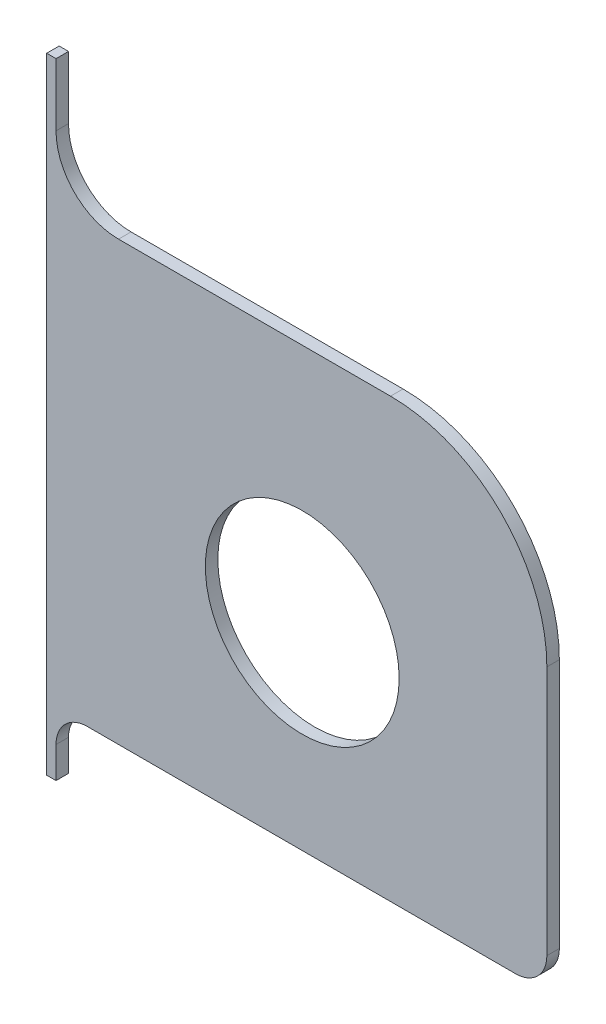
ISO-10303-21;
HEADER;
FILE_DESCRIPTION(('STEP AP214'),'2;1');
FILE_NAME('part.step','',(''),(''),'','','');
FILE_SCHEMA(('AUTOMOTIVE_DESIGN { 1 0 10303 214 1 1 1 1 }'));
ENDSEC;
DATA;
#1=APPLICATION_CONTEXT('core data for automotive mechanical design processes');
#2=APPLICATION_PROTOCOL_DEFINITION('international standard','automotive_design',2000,#1);
#3=PRODUCT_CONTEXT('',#1,'mechanical');
#4=PRODUCT('Part','Part','',(#3));
#5=PRODUCT_RELATED_PRODUCT_CATEGORY('part','',(#4));
#6=PRODUCT_DEFINITION_FORMATION('','',#4);
#7=PRODUCT_DEFINITION_CONTEXT('part definition',#1,'design');
#8=PRODUCT_DEFINITION('design','',#6,#7);
#9=PRODUCT_DEFINITION_SHAPE('','',#8);
#10=(LENGTH_UNIT() NAMED_UNIT(*) SI_UNIT(.MILLI.,.METRE.));
#11=(NAMED_UNIT(*) PLANE_ANGLE_UNIT() SI_UNIT($,.RADIAN.));
#12=(NAMED_UNIT(*) SI_UNIT($,.STERADIAN.) SOLID_ANGLE_UNIT());
#13=UNCERTAINTY_MEASURE_WITH_UNIT(LENGTH_MEASURE(1.E-05),#10,'distance_accuracy_value','');
#14=(GEOMETRIC_REPRESENTATION_CONTEXT(3) GLOBAL_UNCERTAINTY_ASSIGNED_CONTEXT((#13)) GLOBAL_UNIT_ASSIGNED_CONTEXT((#10,
#11,#12)) REPRESENTATION_CONTEXT('',''));
#15=CARTESIAN_POINT('',(0.,0.,0.));
#16=DIRECTION('',(0.,0.,1.));
#17=DIRECTION('',(1.,0.,0.));
#18=AXIS2_PLACEMENT_3D('',#15,#16,#17);
#19=CARTESIAN_POINT('',(15.,15.,40.));
#20=DIRECTION('',(0.,0.,-1.));
#21=DIRECTION('',(-1.,0.,0.));
#22=AXIS2_PLACEMENT_3D('',#19,#20,#21);
#23=PLANE('',#22);
#24=CARTESIAN_POINT('',(0.88000000000002,1.59999999999999,40.));
#25=DIRECTION('',(0.,0.,1.));
#26=DIRECTION('',(1.,0.,0.));
#27=AXIS2_PLACEMENT_3D('',#24,#25,#26);
#28=CIRCLE('',#27,15.5);
#29=CARTESIAN_POINT('',(16.38,1.59999999999999,40.));
#30=VERTEX_POINT('',#29);
#31=EDGE_CURVE('E152',#30,#30,#28,.T.);
#32=ORIENTED_EDGE('',*,*,#31,.F.);
#33=EDGE_LOOP('',(#32));
#34=FACE_BOUND('',#33,.T.);
#35=CARTESIAN_POINT('',(-28.5,50.,40.));
#36=DIRECTION('',(0.,0.,-1.));
#37=DIRECTION('',(-1.,0.,0.));
#38=AXIS2_PLACEMENT_3D('',#35,#36,#37);
#39=CIRCLE('',#38,10.);
#40=CARTESIAN_POINT('',(-38.5,50.0000000000001,40.));
#41=VERTEX_POINT('',#40);
#42=CARTESIAN_POINT('',(-28.4999999999999,40.,40.));
#43=VERTEX_POINT('',#42);
#44=EDGE_CURVE('E215',#41,#43,#39,.F.);
#45=ORIENTED_EDGE('',*,*,#44,.F.);
#46=DIRECTION('',(0.,-1.,0.));
#47=VECTOR('',#46,1.);
#48=CARTESIAN_POINT('',(-38.5,60.,40.));
#49=LINE('',#48,#47);
#50=CARTESIAN_POINT('',(-38.5,60.,40.));
#51=VERTEX_POINT('',#50);
#52=EDGE_CURVE('E42',#51,#41,#49,.T.);
#53=ORIENTED_EDGE('',*,*,#52,.F.);
#54=DIRECTION('',(1.,0.,0.));
#55=VECTOR('',#54,1.);
#56=CARTESIAN_POINT('',(-40.,60.,40.));
#57=LINE('',#56,#55);
#58=CARTESIAN_POINT('',(-40.,60.,40.));
#59=VERTEX_POINT('',#58);
#60=EDGE_CURVE('E11',#59,#51,#57,.T.);
#61=ORIENTED_EDGE('',*,*,#60,.F.);
#62=DIRECTION('',(0.,1.,0.));
#63=VECTOR('',#62,1.);
#64=CARTESIAN_POINT('',(-40.,0.,40.));
#65=LINE('',#64,#63);
#66=CARTESIAN_POINT('',(-40.,-40.,40.));
#67=VERTEX_POINT('',#66);
#68=EDGE_CURVE('E208',#67,#59,#65,.T.);
#69=ORIENTED_EDGE('',*,*,#68,.F.);
#70=DIRECTION('',(-1.,0.,0.));
#71=VECTOR('',#70,1.);
#72=CARTESIAN_POINT('',(-40.,-40.,40.));
#73=LINE('',#72,#71);
#74=CARTESIAN_POINT('',(-38.5,-40.,40.));
#75=VERTEX_POINT('',#74);
#76=EDGE_CURVE('E198',#75,#67,#73,.T.);
#77=ORIENTED_EDGE('',*,*,#76,.F.);
#78=DIRECTION('',(0.,-1.,0.));
#79=VECTOR('',#78,1.);
#80=CARTESIAN_POINT('',(-38.5,-40.,40.));
#81=LINE('',#80,#79);
#82=CARTESIAN_POINT('',(-38.5,-35.,40.));
#83=VERTEX_POINT('',#82);
#84=EDGE_CURVE('E206',#83,#75,#81,.T.);
#85=ORIENTED_EDGE('',*,*,#84,.F.);
#86=CARTESIAN_POINT('',(-33.5,-35.,40.));
#87=DIRECTION('',(0.,0.,-1.));
#88=DIRECTION('',(-1.,0.,0.));
#89=AXIS2_PLACEMENT_3D('',#86,#87,#88);
#90=CIRCLE('',#89,5.);
#91=CARTESIAN_POINT('',(-33.5,-30.,40.));
#92=VERTEX_POINT('',#91);
#93=EDGE_CURVE('E210',#92,#83,#90,.F.);
#94=ORIENTED_EDGE('',*,*,#93,.F.);
#95=DIRECTION('',(-1.,0.,0.));
#96=VECTOR('',#95,1.);
#97=CARTESIAN_POINT('',(35.,-30.,40.));
#98=LINE('',#97,#96);
#99=CARTESIAN_POINT('',(35.,-30.,40.));
#100=VERTEX_POINT('',#99);
#101=EDGE_CURVE('E56',#100,#92,#98,.T.);
#102=ORIENTED_EDGE('',*,*,#101,.F.);
#103=CARTESIAN_POINT('',(35.,-25.,40.));
#104=DIRECTION('',(0.,0.,-1.));
#105=DIRECTION('',(-1.,0.,0.));
#106=AXIS2_PLACEMENT_3D('',#103,#104,#105);
#107=CIRCLE('',#106,5.);
#108=CARTESIAN_POINT('',(40.,-25.,40.));
#109=VERTEX_POINT('',#108);
#110=EDGE_CURVE('E211',#109,#100,#107,.T.);
#111=ORIENTED_EDGE('',*,*,#110,.F.);
#112=DIRECTION('',(0.,-1.,0.));
#113=VECTOR('',#112,1.);
#114=CARTESIAN_POINT('',(40.,0.,40.));
#115=LINE('',#114,#113);
#116=CARTESIAN_POINT('',(40.,14.9999999999998,40.));
#117=VERTEX_POINT('',#116);
#118=EDGE_CURVE('E217',#117,#109,#115,.T.);
#119=ORIENTED_EDGE('',*,*,#118,.F.);
#120=CARTESIAN_POINT('',(15.,15.,40.));
#121=DIRECTION('',(0.,0.,-1.));
#122=DIRECTION('',(-1.,0.,0.));
#123=AXIS2_PLACEMENT_3D('',#120,#121,#122);
#124=CIRCLE('',#123,25.);
#125=CARTESIAN_POINT('',(14.9999999999998,40.,40.));
#126=VERTEX_POINT('',#125);
#127=EDGE_CURVE('E131',#126,#117,#124,.T.);
#128=ORIENTED_EDGE('',*,*,#127,.F.);
#129=DIRECTION('',(1.,0.,0.));
#130=VECTOR('',#129,1.);
#131=CARTESIAN_POINT('',(-28.4999999999999,40.,40.));
#132=LINE('',#131,#130);
#133=EDGE_CURVE('E219',#43,#126,#132,.T.);
#134=ORIENTED_EDGE('',*,*,#133,.F.);
#135=EDGE_LOOP('',(#45,#53,#61,#69,#77,#85,#94,#102,#111,#119,#128,#134));
#136=FACE_BOUND('',#135,.T.);
#137=ADVANCED_FACE('F33',(#34,#136),#23,.F.);
#138=CARTESIAN_POINT('',(-40.,60.,130.));
#139=DIRECTION('',(0.,-1.,0.));
#140=DIRECTION('',(0.,0.,-1.));
#141=AXIS2_PLACEMENT_3D('',#138,#139,#140);
#142=PLANE('',#141);
#143=DIRECTION('',(0.,0.,-1.));
#144=VECTOR('',#143,1.);
#145=CARTESIAN_POINT('',(-40.,60.,130.));
#146=LINE('',#145,#144);
#147=CARTESIAN_POINT('',(-40.,60.,38.));
#148=VERTEX_POINT('',#147);
#149=EDGE_CURVE('E180',#59,#148,#146,.T.);
#150=ORIENTED_EDGE('',*,*,#149,.F.);
#151=ORIENTED_EDGE('',*,*,#60,.T.);
#152=DIRECTION('',(0.,0.,-1.));
#153=VECTOR('',#152,1.);
#154=CARTESIAN_POINT('',(-38.5,60.,130.));
#155=LINE('',#154,#153);
#156=CARTESIAN_POINT('',(-38.5,60.,38.));
#157=VERTEX_POINT('',#156);
#158=EDGE_CURVE('E181',#51,#157,#155,.T.);
#159=ORIENTED_EDGE('',*,*,#158,.T.);
#160=DIRECTION('',(1.,0.,0.));
#161=VECTOR('',#160,1.);
#162=CARTESIAN_POINT('',(-40.,60.,38.));
#163=LINE('',#162,#161);
#164=EDGE_CURVE('E171',#148,#157,#163,.T.);
#165=ORIENTED_EDGE('',*,*,#164,.F.);
#166=EDGE_LOOP('',(#150,#151,#159,#165));
#167=FACE_BOUND('',#166,.T.);
#168=ADVANCED_FACE('F252',(#167),#142,.F.);
#169=CARTESIAN_POINT('',(35.,-30.,130.));
#170=DIRECTION('',(0.,1.,0.));
#171=DIRECTION('',(-1.,0.,0.));
#172=AXIS2_PLACEMENT_3D('',#169,#170,#171);
#173=PLANE('',#172);
#174=DIRECTION('',(0.,0.,-1.));
#175=VECTOR('',#174,1.);
#176=CARTESIAN_POINT('',(35.,-30.,130.));
#177=LINE('',#176,#175);
#178=CARTESIAN_POINT('',(35.,-30.,38.));
#179=VERTEX_POINT('',#178);
#180=EDGE_CURVE('E188',#100,#179,#177,.T.);
#181=ORIENTED_EDGE('',*,*,#180,.F.);
#182=ORIENTED_EDGE('',*,*,#101,.T.);
#183=DIRECTION('',(0.,0.,-1.));
#184=VECTOR('',#183,1.);
#185=CARTESIAN_POINT('',(-33.5,-30.,130.));
#186=LINE('',#185,#184);
#187=CARTESIAN_POINT('',(-33.5,-30.,38.));
#188=VERTEX_POINT('',#187);
#189=EDGE_CURVE('E190',#92,#188,#186,.T.);
#190=ORIENTED_EDGE('',*,*,#189,.T.);
#191=DIRECTION('',(-1.,0.,0.));
#192=VECTOR('',#191,1.);
#193=CARTESIAN_POINT('',(35.,-30.,38.));
#194=LINE('',#193,#192);
#195=EDGE_CURVE('E156',#179,#188,#194,.T.);
#196=ORIENTED_EDGE('',*,*,#195,.F.);
#197=EDGE_LOOP('',(#181,#182,#190,#196));
#198=FACE_BOUND('',#197,.T.);
#199=ADVANCED_FACE('F232',(#198),#173,.F.);
#200=CARTESIAN_POINT('',(-38.5,60.,130.));
#201=DIRECTION('',(-1.,0.,0.));
#202=DIRECTION('',(0.,0.,1.));
#203=AXIS2_PLACEMENT_3D('',#200,#201,#202);
#204=PLANE('',#203);
#205=ORIENTED_EDGE('',*,*,#158,.F.);
#206=ORIENTED_EDGE('',*,*,#52,.T.);
#207=DIRECTION('',(0.,0.,-1.));
#208=VECTOR('',#207,1.);
#209=CARTESIAN_POINT('',(-38.5,50.0000000000001,130.));
#210=LINE('',#209,#208);
#211=CARTESIAN_POINT('',(-38.5,50.0000000000001,38.));
#212=VERTEX_POINT('',#211);
#213=EDGE_CURVE('E183',#41,#212,#210,.T.);
#214=ORIENTED_EDGE('',*,*,#213,.T.);
#215=DIRECTION('',(0.,-1.,0.));
#216=VECTOR('',#215,1.);
#217=CARTESIAN_POINT('',(-38.5,60.,38.));
#218=LINE('',#217,#216);
#219=EDGE_CURVE('E174',#157,#212,#218,.T.);
#220=ORIENTED_EDGE('',*,*,#219,.F.);
#221=EDGE_LOOP('',(#205,#206,#214,#220));
#222=FACE_BOUND('',#221,.T.);
#223=ADVANCED_FACE('F257',(#222),#204,.F.);
#224=CARTESIAN_POINT('',(35.,-25.,130.));
#225=DIRECTION('',(0.,0.,-1.));
#226=DIRECTION('',(-1.,0.,0.));
#227=AXIS2_PLACEMENT_3D('',#224,#225,#226);
#228=CYLINDRICAL_SURFACE('',#227,5.);
#229=DIRECTION('',(0.,0.,-1.));
#230=VECTOR('',#229,1.);
#231=CARTESIAN_POINT('',(40.,-25.,130.));
#232=LINE('',#231,#230);
#233=CARTESIAN_POINT('',(40.,-25.,38.));
#234=VERTEX_POINT('',#233);
#235=EDGE_CURVE('E134',#109,#234,#232,.T.);
#236=ORIENTED_EDGE('',*,*,#235,.F.);
#237=ORIENTED_EDGE('',*,*,#110,.T.);
#238=ORIENTED_EDGE('',*,*,#180,.T.);
#239=CARTESIAN_POINT('',(35.,-25.,38.));
#240=DIRECTION('',(0.,0.,-1.));
#241=DIRECTION('',(-1.,0.,0.));
#242=AXIS2_PLACEMENT_3D('',#239,#240,#241);
#243=CIRCLE('',#242,4.99999999999999);
#244=EDGE_CURVE('E143',#234,#179,#243,.T.);
#245=ORIENTED_EDGE('',*,*,#244,.F.);
#246=EDGE_LOOP('',(#236,#237,#238,#245));
#247=FACE_BOUND('',#246,.T.);
#248=ADVANCED_FACE('F229',(#247),#228,.T.);
#249=CARTESIAN_POINT('',(-28.5,50.,130.));
#250=DIRECTION('',(0.,0.,-1.));
#251=DIRECTION('',(-1.,0.,0.));
#252=AXIS2_PLACEMENT_3D('',#249,#250,#251);
#253=CYLINDRICAL_SURFACE('',#252,10.);
#254=ORIENTED_EDGE('',*,*,#213,.F.);
#255=ORIENTED_EDGE('',*,*,#44,.T.);
#256=DIRECTION('',(0.,0.,-1.));
#257=VECTOR('',#256,1.);
#258=CARTESIAN_POINT('',(-28.4999999999999,40.,130.));
#259=LINE('',#258,#257);
#260=CARTESIAN_POINT('',(-28.4999999999999,40.,38.));
#261=VERTEX_POINT('',#260);
#262=EDGE_CURVE('E185',#43,#261,#259,.T.);
#263=ORIENTED_EDGE('',*,*,#262,.T.);
#264=CARTESIAN_POINT('',(-28.5,50.,38.));
#265=DIRECTION('',(0.,0.,1.));
#266=DIRECTION('',(-1.,0.,0.));
#267=AXIS2_PLACEMENT_3D('',#264,#265,#266);
#268=CIRCLE('',#267,10.);
#269=EDGE_CURVE('E177',#212,#261,#268,.T.);
#270=ORIENTED_EDGE('',*,*,#269,.F.);
#271=EDGE_LOOP('',(#254,#255,#263,#270));
#272=FACE_BOUND('',#271,.T.);
#273=ADVANCED_FACE('F260',(#272),#253,.F.);
#274=CARTESIAN_POINT('',(-33.5,-35.,130.));
#275=DIRECTION('',(0.,0.,-1.));
#276=DIRECTION('',(-1.,0.,0.));
#277=AXIS2_PLACEMENT_3D('',#274,#275,#276);
#278=CYLINDRICAL_SURFACE('',#277,5.);
#279=ORIENTED_EDGE('',*,*,#189,.F.);
#280=ORIENTED_EDGE('',*,*,#93,.T.);
#281=DIRECTION('',(0.,0.,-1.));
#282=VECTOR('',#281,1.);
#283=CARTESIAN_POINT('',(-38.5,-35.,130.));
#284=LINE('',#283,#282);
#285=CARTESIAN_POINT('',(-38.5,-35.,38.));
#286=VERTEX_POINT('',#285);
#287=EDGE_CURVE('E192',#83,#286,#284,.T.);
#288=ORIENTED_EDGE('',*,*,#287,.T.);
#289=CARTESIAN_POINT('',(-33.5,-35.,38.));
#290=DIRECTION('',(0.,0.,1.));
#291=DIRECTION('',(-1.,0.,0.));
#292=AXIS2_PLACEMENT_3D('',#289,#290,#291);
#293=CIRCLE('',#292,5.);
#294=EDGE_CURVE('E159',#188,#286,#293,.T.);
#295=ORIENTED_EDGE('',*,*,#294,.F.);
#296=EDGE_LOOP('',(#279,#280,#288,#295));
#297=FACE_BOUND('',#296,.T.);
#298=ADVANCED_FACE('F235',(#297),#278,.F.);
#299=CARTESIAN_POINT('',(15.,15.,38.));
#300=DIRECTION('',(0.,0.,-1.));
#301=DIRECTION('',(-1.,0.,0.));
#302=AXIS2_PLACEMENT_3D('',#299,#300,#301);
#303=PLANE('',#302);
#304=CARTESIAN_POINT('',(0.88000000000002,1.59999999999999,38.));
#305=DIRECTION('',(0.,0.,-1.));
#306=DIRECTION('',(-1.,0.,0.));
#307=AXIS2_PLACEMENT_3D('',#304,#305,#306);
#308=CIRCLE('',#307,15.5);
#309=CARTESIAN_POINT('',(-14.62,1.59999999999999,38.));
#310=VERTEX_POINT('',#309);
#311=EDGE_CURVE('E37',#310,#310,#308,.T.);
#312=ORIENTED_EDGE('',*,*,#311,.F.);
#313=EDGE_LOOP('',(#312));
#314=FACE_BOUND('',#313,.T.);
#315=CARTESIAN_POINT('',(15.,15.,38.));
#316=DIRECTION('',(0.,0.,-1.));
#317=DIRECTION('',(-1.,0.,0.));
#318=AXIS2_PLACEMENT_3D('',#315,#316,#317);
#319=CIRCLE('',#318,25.);
#320=CARTESIAN_POINT('',(14.9999999999998,40.,38.));
#321=VERTEX_POINT('',#320);
#322=CARTESIAN_POINT('',(40.,14.9999999999998,38.));
#323=VERTEX_POINT('',#322);
#324=EDGE_CURVE('E129',#321,#323,#319,.T.);
#325=ORIENTED_EDGE('',*,*,#324,.T.);
#326=DIRECTION('',(0.,-1.,0.));
#327=VECTOR('',#326,1.);
#328=CARTESIAN_POINT('',(40.,14.9999999999998,38.));
#329=LINE('',#328,#327);
#330=EDGE_CURVE('E138',#323,#234,#329,.T.);
#331=ORIENTED_EDGE('',*,*,#330,.T.);
#332=ORIENTED_EDGE('',*,*,#244,.T.);
#333=ORIENTED_EDGE('',*,*,#195,.T.);
#334=ORIENTED_EDGE('',*,*,#294,.T.);
#335=DIRECTION('',(0.,-1.,0.));
#336=VECTOR('',#335,1.);
#337=CARTESIAN_POINT('',(-38.5,-35.,38.));
#338=LINE('',#337,#336);
#339=CARTESIAN_POINT('',(-38.5,-40.,38.));
#340=VERTEX_POINT('',#339);
#341=EDGE_CURVE('E162',#286,#340,#338,.T.);
#342=ORIENTED_EDGE('',*,*,#341,.T.);
#343=DIRECTION('',(-1.,0.,0.));
#344=VECTOR('',#343,1.);
#345=CARTESIAN_POINT('',(-38.5,-40.,38.));
#346=LINE('',#345,#344);
#347=CARTESIAN_POINT('',(-40.,-40.,38.));
#348=VERTEX_POINT('',#347);
#349=EDGE_CURVE('E165',#340,#348,#346,.T.);
#350=ORIENTED_EDGE('',*,*,#349,.T.);
#351=DIRECTION('',(0.,1.,0.));
#352=VECTOR('',#351,1.);
#353=CARTESIAN_POINT('',(-40.,-40.,38.));
#354=LINE('',#353,#352);
#355=EDGE_CURVE('E168',#348,#148,#354,.T.);
#356=ORIENTED_EDGE('',*,*,#355,.T.);
#357=ORIENTED_EDGE('',*,*,#164,.T.);
#358=ORIENTED_EDGE('',*,*,#219,.T.);
#359=ORIENTED_EDGE('',*,*,#269,.T.);
#360=DIRECTION('',(1.,0.,0.));
#361=VECTOR('',#360,1.);
#362=CARTESIAN_POINT('',(-28.4999999999999,40.,38.));
#363=LINE('',#362,#361);
#364=EDGE_CURVE('E149',#261,#321,#363,.T.);
#365=ORIENTED_EDGE('',*,*,#364,.T.);
#366=EDGE_LOOP('',(#325,#331,#332,#333,#334,#342,#350,#356,#357,#358,#359,#365));
#367=FACE_BOUND('',#366,.T.);
#368=ADVANCED_FACE('F146',(#314,#367),#303,.T.);
#369=CARTESIAN_POINT('',(-40.,0.,40.));
#370=DIRECTION('',(1.,0.,0.));
#371=DIRECTION('',(0.,0.,-1.));
#372=AXIS2_PLACEMENT_3D('',#369,#370,#371);
#373=PLANE('',#372);
#374=DIRECTION('',(0.,0.,-1.));
#375=VECTOR('',#374,1.);
#376=CARTESIAN_POINT('',(-40.,-40.,130.));
#377=LINE('',#376,#375);
#378=EDGE_CURVE('E196',#67,#348,#377,.T.);
#379=ORIENTED_EDGE('',*,*,#378,.F.);
#380=ORIENTED_EDGE('',*,*,#68,.T.);
#381=ORIENTED_EDGE('',*,*,#149,.T.);
#382=ORIENTED_EDGE('',*,*,#355,.F.);
#383=EDGE_LOOP('',(#379,#380,#381,#382));
#384=FACE_BOUND('',#383,.T.);
#385=ADVANCED_FACE('F251',(#384),#373,.F.);
#386=CARTESIAN_POINT('',(-38.5,-40.,130.));
#387=DIRECTION('',(-1.,0.,0.));
#388=DIRECTION('',(0.,0.,1.));
#389=AXIS2_PLACEMENT_3D('',#386,#387,#388);
#390=PLANE('',#389);
#391=ORIENTED_EDGE('',*,*,#287,.F.);
#392=ORIENTED_EDGE('',*,*,#84,.T.);
#393=DIRECTION('',(0.,0.,-1.));
#394=VECTOR('',#393,1.);
#395=CARTESIAN_POINT('',(-38.5,-40.,130.));
#396=LINE('',#395,#394);
#397=EDGE_CURVE('E194',#75,#340,#396,.T.);
#398=ORIENTED_EDGE('',*,*,#397,.T.);
#399=ORIENTED_EDGE('',*,*,#341,.F.);
#400=EDGE_LOOP('',(#391,#392,#398,#399));
#401=FACE_BOUND('',#400,.T.);
#402=ADVANCED_FACE('F241',(#401),#390,.F.);
#403=CARTESIAN_POINT('',(-40.,-40.,130.));
#404=DIRECTION('',(0.,1.,0.));
#405=DIRECTION('',(0.,0.,1.));
#406=AXIS2_PLACEMENT_3D('',#403,#404,#405);
#407=PLANE('',#406);
#408=ORIENTED_EDGE('',*,*,#397,.F.);
#409=ORIENTED_EDGE('',*,*,#76,.T.);
#410=ORIENTED_EDGE('',*,*,#378,.T.);
#411=ORIENTED_EDGE('',*,*,#349,.F.);
#412=EDGE_LOOP('',(#408,#409,#410,#411));
#413=FACE_BOUND('',#412,.T.);
#414=ADVANCED_FACE('F245',(#413),#407,.F.);
#415=CARTESIAN_POINT('',(40.,0.,40.));
#416=DIRECTION('',(-1.,0.,0.));
#417=DIRECTION('',(0.,-1.,0.));
#418=AXIS2_PLACEMENT_3D('',#415,#416,#417);
#419=PLANE('',#418);
#420=DIRECTION('',(0.,0.,-1.));
#421=VECTOR('',#420,1.);
#422=CARTESIAN_POINT('',(40.,14.9999999999998,130.));
#423=LINE('',#422,#421);
#424=EDGE_CURVE('E124',#117,#323,#423,.T.);
#425=ORIENTED_EDGE('',*,*,#424,.F.);
#426=ORIENTED_EDGE('',*,*,#118,.T.);
#427=ORIENTED_EDGE('',*,*,#235,.T.);
#428=ORIENTED_EDGE('',*,*,#330,.F.);
#429=EDGE_LOOP('',(#425,#426,#427,#428));
#430=FACE_BOUND('',#429,.T.);
#431=ADVANCED_FACE('F35',(#430),#419,.F.);
#432=CARTESIAN_POINT('',(-28.4999999999999,40.,130.));
#433=DIRECTION('',(0.,-1.,0.));
#434=DIRECTION('',(1.,0.,0.));
#435=AXIS2_PLACEMENT_3D('',#432,#433,#434);
#436=PLANE('',#435);
#437=ORIENTED_EDGE('',*,*,#262,.F.);
#438=ORIENTED_EDGE('',*,*,#133,.T.);
#439=DIRECTION('',(0.,0.,-1.));
#440=VECTOR('',#439,1.);
#441=CARTESIAN_POINT('',(14.9999999999998,40.,130.));
#442=LINE('',#441,#440);
#443=EDGE_CURVE('E135',#126,#321,#442,.T.);
#444=ORIENTED_EDGE('',*,*,#443,.T.);
#445=ORIENTED_EDGE('',*,*,#364,.F.);
#446=EDGE_LOOP('',(#437,#438,#444,#445));
#447=FACE_BOUND('',#446,.T.);
#448=ADVANCED_FACE('F224',(#447),#436,.F.);
#449=CARTESIAN_POINT('',(15.,15.,130.));
#450=DIRECTION('',(0.,0.,-1.));
#451=DIRECTION('',(-1.,0.,0.));
#452=AXIS2_PLACEMENT_3D('',#449,#450,#451);
#453=CYLINDRICAL_SURFACE('',#452,25.);
#454=ORIENTED_EDGE('',*,*,#443,.F.);
#455=ORIENTED_EDGE('',*,*,#127,.T.);
#456=ORIENTED_EDGE('',*,*,#424,.T.);
#457=ORIENTED_EDGE('',*,*,#324,.F.);
#458=EDGE_LOOP('',(#454,#455,#456,#457));
#459=FACE_BOUND('',#458,.T.);
#460=ADVANCED_FACE('F127',(#459),#453,.T.);
#461=CARTESIAN_POINT('',(0.88000000000002,1.59999999999999,30.));
#462=DIRECTION('',(0.,0.,1.));
#463=DIRECTION('',(1.,0.,0.));
#464=AXIS2_PLACEMENT_3D('',#461,#462,#463);
#465=CYLINDRICAL_SURFACE('',#464,15.5);
#466=ORIENTED_EDGE('',*,*,#311,.T.);
#467=EDGE_LOOP('',(#466));
#468=FACE_BOUND('',#467,.T.);
#469=ORIENTED_EDGE('',*,*,#31,.T.);
#470=EDGE_LOOP('',(#469));
#471=FACE_BOUND('',#470,.T.);
#472=ADVANCED_FACE('F272',(#468,#471),#465,.F.);
#473=CLOSED_SHELL('',(#137,#168,#199,#223,#248,#273,#298,#368,#385,#402,#414,#431,#448,#460,#472));
#474=MANIFOLD_SOLID_BREP('B2',#473);
#475=ADVANCED_BREP_SHAPE_REPRESENTATION('',(#18,#474),#14);
#476=SHAPE_DEFINITION_REPRESENTATION(#9,#475);
ENDSEC;
END-ISO-10303-21;
